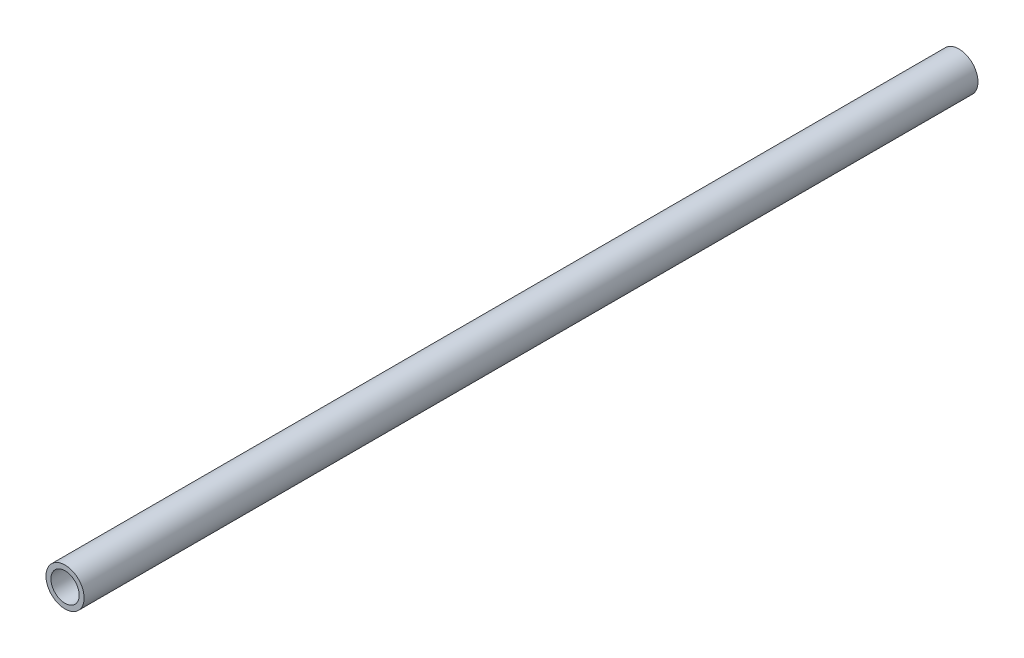
ISO-10303-21;
HEADER;
FILE_DESCRIPTION(('STEP AP214'),'2;1');
FILE_NAME('part.step','',(''),(''),'','','');
FILE_SCHEMA(('AUTOMOTIVE_DESIGN { 1 0 10303 214 1 1 1 1 }'));
ENDSEC;
DATA;
#1=APPLICATION_CONTEXT('core data for automotive mechanical design processes');
#2=APPLICATION_PROTOCOL_DEFINITION('international standard','automotive_design',2000,#1);
#3=PRODUCT_CONTEXT('',#1,'mechanical');
#4=PRODUCT('Part','Part','',(#3));
#5=PRODUCT_RELATED_PRODUCT_CATEGORY('part','',(#4));
#6=PRODUCT_DEFINITION_FORMATION('','',#4);
#7=PRODUCT_DEFINITION_CONTEXT('part definition',#1,'design');
#8=PRODUCT_DEFINITION('design','',#6,#7);
#9=PRODUCT_DEFINITION_SHAPE('','',#8);
#10=(LENGTH_UNIT() NAMED_UNIT(*) SI_UNIT(.MILLI.,.METRE.));
#11=(NAMED_UNIT(*) PLANE_ANGLE_UNIT() SI_UNIT($,.RADIAN.));
#12=(NAMED_UNIT(*) SI_UNIT($,.STERADIAN.) SOLID_ANGLE_UNIT());
#13=UNCERTAINTY_MEASURE_WITH_UNIT(LENGTH_MEASURE(1.E-05),#10,'distance_accuracy_value','');
#14=(GEOMETRIC_REPRESENTATION_CONTEXT(3) GLOBAL_UNCERTAINTY_ASSIGNED_CONTEXT((#13)) GLOBAL_UNIT_ASSIGNED_CONTEXT((#10,
#11,#12)) REPRESENTATION_CONTEXT('',''));
#15=CARTESIAN_POINT('',(0.,0.,0.));
#16=DIRECTION('',(0.,0.,1.));
#17=DIRECTION('',(1.,0.,0.));
#18=AXIS2_PLACEMENT_3D('',#15,#16,#17);
#19=CARTESIAN_POINT('',(0.,0.,250.));
#20=DIRECTION('',(0.,0.,1.));
#21=DIRECTION('',(1.,0.,0.));
#22=AXIS2_PLACEMENT_3D('',#19,#20,#21);
#23=PLANE('',#22);
#24=CARTESIAN_POINT('',(0.,0.,250.));
#25=DIRECTION('',(0.,0.,1.));
#26=DIRECTION('',(1.,0.,0.));
#27=AXIS2_PLACEMENT_3D('',#24,#25,#26);
#28=CIRCLE('',#27,10.668);
#29=CARTESIAN_POINT('',(10.668,0.,250.));
#30=VERTEX_POINT('',#29);
#31=EDGE_CURVE('E11',#30,#30,#28,.T.);
#32=ORIENTED_EDGE('',*,*,#31,.T.);
#33=EDGE_LOOP('',(#32));
#34=FACE_BOUND('',#33,.T.);
#35=CARTESIAN_POINT('',(0.,0.,250.));
#36=DIRECTION('',(0.,0.,1.));
#37=DIRECTION('',(1.,0.,0.));
#38=AXIS2_PLACEMENT_3D('',#35,#36,#37);
#39=CIRCLE('',#38,7.8994);
#40=CARTESIAN_POINT('',(7.8994,0.,250.));
#41=VERTEX_POINT('',#40);
#42=EDGE_CURVE('E56',#41,#41,#39,.T.);
#43=ORIENTED_EDGE('',*,*,#42,.F.);
#44=EDGE_LOOP('',(#43));
#45=FACE_BOUND('',#44,.T.);
#46=ADVANCED_FACE('F43',(#34,#45),#23,.T.);
#47=CARTESIAN_POINT('',(0.,0.,-250.));
#48=DIRECTION('',(0.,0.,1.));
#49=DIRECTION('',(1.,0.,0.));
#50=AXIS2_PLACEMENT_3D('',#47,#48,#49);
#51=PLANE('',#50);
#52=CARTESIAN_POINT('',(0.,0.,-250.));
#53=DIRECTION('',(0.,0.,1.));
#54=DIRECTION('',(1.,0.,0.));
#55=AXIS2_PLACEMENT_3D('',#52,#53,#54);
#56=CIRCLE('',#55,10.668);
#57=CARTESIAN_POINT('',(10.668,0.,-250.));
#58=VERTEX_POINT('',#57);
#59=EDGE_CURVE('E47',#58,#58,#56,.T.);
#60=ORIENTED_EDGE('',*,*,#59,.F.);
#61=EDGE_LOOP('',(#60));
#62=FACE_BOUND('',#61,.T.);
#63=CARTESIAN_POINT('',(0.,0.,-250.));
#64=DIRECTION('',(0.,0.,1.));
#65=DIRECTION('',(1.,0.,0.));
#66=AXIS2_PLACEMENT_3D('',#63,#64,#65);
#67=CIRCLE('',#66,7.8994);
#68=CARTESIAN_POINT('',(7.8994,0.,-250.));
#69=VERTEX_POINT('',#68);
#70=EDGE_CURVE('E58',#69,#69,#67,.T.);
#71=ORIENTED_EDGE('',*,*,#70,.T.);
#72=EDGE_LOOP('',(#71));
#73=FACE_BOUND('',#72,.T.);
#74=ADVANCED_FACE('F70',(#62,#73),#51,.F.);
#75=CARTESIAN_POINT('',(0.,0.,250.));
#76=DIRECTION('',(0.,0.,-1.));
#77=DIRECTION('',(-1.,0.,0.));
#78=AXIS2_PLACEMENT_3D('',#75,#76,#77);
#79=CYLINDRICAL_SURFACE('',#78,10.668);
#80=ORIENTED_EDGE('',*,*,#31,.F.);
#81=EDGE_LOOP('',(#80));
#82=FACE_BOUND('',#81,.T.);
#83=ORIENTED_EDGE('',*,*,#59,.T.);
#84=EDGE_LOOP('',(#83));
#85=FACE_BOUND('',#84,.T.);
#86=ADVANCED_FACE('F45',(#82,#85),#79,.T.);
#87=CARTESIAN_POINT('',(0.,0.,250.));
#88=DIRECTION('',(0.,0.,-1.));
#89=DIRECTION('',(-1.,0.,0.));
#90=AXIS2_PLACEMENT_3D('',#87,#88,#89);
#91=CYLINDRICAL_SURFACE('',#90,7.8994);
#92=ORIENTED_EDGE('',*,*,#42,.T.);
#93=EDGE_LOOP('',(#92));
#94=FACE_BOUND('',#93,.T.);
#95=ORIENTED_EDGE('',*,*,#70,.F.);
#96=EDGE_LOOP('',(#95));
#97=FACE_BOUND('',#96,.T.);
#98=ADVANCED_FACE('F66',(#94,#97),#91,.F.);
#99=CLOSED_SHELL('',(#46,#74,#86,#98));
#100=MANIFOLD_SOLID_BREP('B2',#99);
#101=ADVANCED_BREP_SHAPE_REPRESENTATION('',(#18,#100),#14);
#102=SHAPE_DEFINITION_REPRESENTATION(#9,#101);
ENDSEC;
END-ISO-10303-21;
